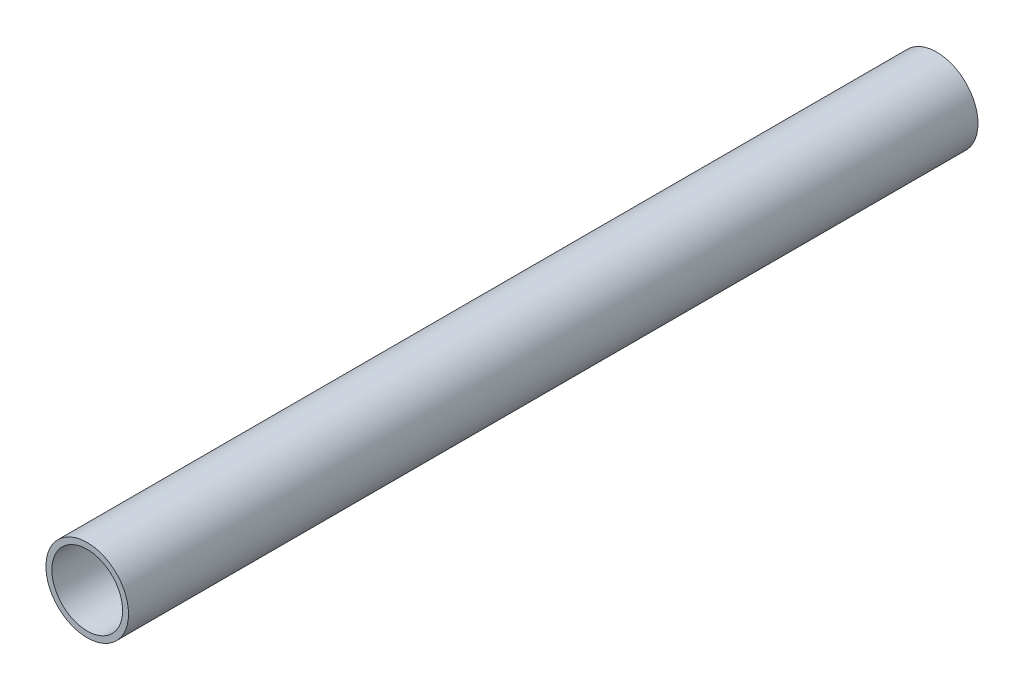
ISO-10303-21;
HEADER;
FILE_DESCRIPTION(('STEP AP214'),'2;1');
FILE_NAME('part.step','',(''),(''),'','','');
FILE_SCHEMA(('AUTOMOTIVE_DESIGN { 1 0 10303 214 1 1 1 1 }'));
ENDSEC;
DATA;
#1=APPLICATION_CONTEXT('core data for automotive mechanical design processes');
#2=APPLICATION_PROTOCOL_DEFINITION('international standard','automotive_design',2000,#1);
#3=PRODUCT_CONTEXT('',#1,'mechanical');
#4=PRODUCT('Part','Part','',(#3));
#5=PRODUCT_RELATED_PRODUCT_CATEGORY('part','',(#4));
#6=PRODUCT_DEFINITION_FORMATION('','',#4);
#7=PRODUCT_DEFINITION_CONTEXT('part definition',#1,'design');
#8=PRODUCT_DEFINITION('design','',#6,#7);
#9=PRODUCT_DEFINITION_SHAPE('','',#8);
#10=(LENGTH_UNIT() NAMED_UNIT(*) SI_UNIT(.MILLI.,.METRE.));
#11=(NAMED_UNIT(*) PLANE_ANGLE_UNIT() SI_UNIT($,.RADIAN.));
#12=(NAMED_UNIT(*) SI_UNIT($,.STERADIAN.) SOLID_ANGLE_UNIT());
#13=UNCERTAINTY_MEASURE_WITH_UNIT(LENGTH_MEASURE(1.E-05),#10,'distance_accuracy_value','');
#14=(GEOMETRIC_REPRESENTATION_CONTEXT(3) GLOBAL_UNCERTAINTY_ASSIGNED_CONTEXT((#13)) GLOBAL_UNIT_ASSIGNED_CONTEXT((#10,
#11,#12)) REPRESENTATION_CONTEXT('',''));
#15=CARTESIAN_POINT('',(0.,0.,0.));
#16=DIRECTION('',(0.,0.,1.));
#17=DIRECTION('',(1.,0.,0.));
#18=AXIS2_PLACEMENT_3D('',#15,#16,#17);
#19=CARTESIAN_POINT('',(0.,0.,114.3));
#20=DIRECTION('',(0.,0.,1.));
#21=DIRECTION('',(1.,0.,0.));
#22=AXIS2_PLACEMENT_3D('',#19,#20,#21);
#23=PLANE('',#22);
#24=CARTESIAN_POINT('',(0.,0.,114.3));
#25=DIRECTION('',(0.,0.,1.));
#26=DIRECTION('',(1.,0.,0.));
#27=AXIS2_PLACEMENT_3D('',#24,#25,#26);
#28=CIRCLE('',#27,11.1125);
#29=CARTESIAN_POINT('',(11.1125,0.,114.3));
#30=VERTEX_POINT('',#29);
#31=EDGE_CURVE('E10',#30,#30,#28,.T.);
#32=ORIENTED_EDGE('',*,*,#31,.T.);
#33=EDGE_LOOP('',(#32));
#34=FACE_BOUND('',#33,.T.);
#35=CARTESIAN_POINT('',(0.,0.,114.3));
#36=DIRECTION('',(0.,0.,1.));
#37=DIRECTION('',(1.,0.,0.));
#38=AXIS2_PLACEMENT_3D('',#35,#36,#37);
#39=CIRCLE('',#38,9.525);
#40=CARTESIAN_POINT('',(9.525,0.,114.3));
#41=VERTEX_POINT('',#40);
#42=EDGE_CURVE('E45',#41,#41,#39,.T.);
#43=ORIENTED_EDGE('',*,*,#42,.F.);
#44=EDGE_LOOP('',(#43));
#45=FACE_BOUND('',#44,.T.);
#46=ADVANCED_FACE('F34',(#34,#45),#23,.T.);
#47=CARTESIAN_POINT('',(0.,0.,-114.3));
#48=DIRECTION('',(0.,0.,1.));
#49=DIRECTION('',(1.,0.,0.));
#50=AXIS2_PLACEMENT_3D('',#47,#48,#49);
#51=PLANE('',#50);
#52=CARTESIAN_POINT('',(0.,0.,-114.3));
#53=DIRECTION('',(0.,0.,1.));
#54=DIRECTION('',(1.,0.,0.));
#55=AXIS2_PLACEMENT_3D('',#52,#53,#54);
#56=CIRCLE('',#55,11.1125);
#57=CARTESIAN_POINT('',(11.1125,0.,-114.3));
#58=VERTEX_POINT('',#57);
#59=EDGE_CURVE('E38',#58,#58,#56,.T.);
#60=ORIENTED_EDGE('',*,*,#59,.F.);
#61=EDGE_LOOP('',(#60));
#62=FACE_BOUND('',#61,.T.);
#63=CARTESIAN_POINT('',(0.,0.,-114.3));
#64=DIRECTION('',(0.,0.,1.));
#65=DIRECTION('',(1.,0.,0.));
#66=AXIS2_PLACEMENT_3D('',#63,#64,#65);
#67=CIRCLE('',#66,9.525);
#68=CARTESIAN_POINT('',(9.525,0.,-114.3));
#69=VERTEX_POINT('',#68);
#70=EDGE_CURVE('E47',#69,#69,#67,.T.);
#71=ORIENTED_EDGE('',*,*,#70,.T.);
#72=EDGE_LOOP('',(#71));
#73=FACE_BOUND('',#72,.T.);
#74=ADVANCED_FACE('F57',(#62,#73),#51,.F.);
#75=CARTESIAN_POINT('',(0.,0.,114.3));
#76=DIRECTION('',(0.,0.,-1.));
#77=DIRECTION('',(-1.,0.,0.));
#78=AXIS2_PLACEMENT_3D('',#75,#76,#77);
#79=CYLINDRICAL_SURFACE('',#78,11.1125);
#80=ORIENTED_EDGE('',*,*,#31,.F.);
#81=EDGE_LOOP('',(#80));
#82=FACE_BOUND('',#81,.T.);
#83=ORIENTED_EDGE('',*,*,#59,.T.);
#84=EDGE_LOOP('',(#83));
#85=FACE_BOUND('',#84,.T.);
#86=ADVANCED_FACE('F36',(#82,#85),#79,.T.);
#87=CARTESIAN_POINT('',(0.,0.,114.3));
#88=DIRECTION('',(0.,0.,-1.));
#89=DIRECTION('',(-1.,0.,0.));
#90=AXIS2_PLACEMENT_3D('',#87,#88,#89);
#91=CYLINDRICAL_SURFACE('',#90,9.525);
#92=ORIENTED_EDGE('',*,*,#42,.T.);
#93=EDGE_LOOP('',(#92));
#94=FACE_BOUND('',#93,.T.);
#95=ORIENTED_EDGE('',*,*,#70,.F.);
#96=EDGE_LOOP('',(#95));
#97=FACE_BOUND('',#96,.T.);
#98=ADVANCED_FACE('F53',(#94,#97),#91,.F.);
#99=CLOSED_SHELL('',(#46,#74,#86,#98));
#100=MANIFOLD_SOLID_BREP('B2',#99);
#101=ADVANCED_BREP_SHAPE_REPRESENTATION('',(#18,#100),#14);
#102=SHAPE_DEFINITION_REPRESENTATION(#9,#101);
ENDSEC;
END-ISO-10303-21;
